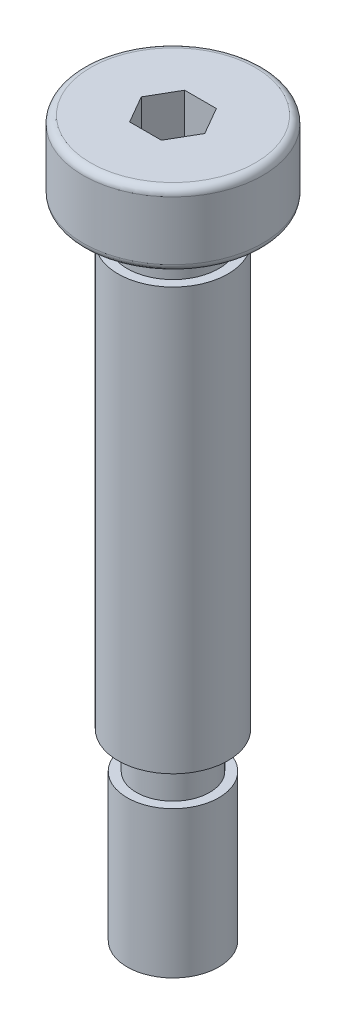
ISO-10303-21;
HEADER;
FILE_DESCRIPTION(('STEP AP214'),'2;1');
FILE_NAME('part.step','',(''),(''),'','','');
FILE_SCHEMA(('AUTOMOTIVE_DESIGN { 1 0 10303 214 1 1 1 1 }'));
ENDSEC;
DATA;
#1=APPLICATION_CONTEXT('core data for automotive mechanical design processes');
#2=APPLICATION_PROTOCOL_DEFINITION('international standard','automotive_design',2000,#1);
#3=PRODUCT_CONTEXT('',#1,'mechanical');
#4=PRODUCT('Part','Part','',(#3));
#5=PRODUCT_RELATED_PRODUCT_CATEGORY('part','',(#4));
#6=PRODUCT_DEFINITION_FORMATION('','',#4);
#7=PRODUCT_DEFINITION_CONTEXT('part definition',#1,'design');
#8=PRODUCT_DEFINITION('design','',#6,#7);
#9=PRODUCT_DEFINITION_SHAPE('','',#8);
#10=(LENGTH_UNIT() NAMED_UNIT(*) SI_UNIT(.MILLI.,.METRE.));
#11=(NAMED_UNIT(*) PLANE_ANGLE_UNIT() SI_UNIT($,.RADIAN.));
#12=(NAMED_UNIT(*) SI_UNIT($,.STERADIAN.) SOLID_ANGLE_UNIT());
#13=UNCERTAINTY_MEASURE_WITH_UNIT(LENGTH_MEASURE(1.E-05),#10,'distance_accuracy_value','');
#14=(GEOMETRIC_REPRESENTATION_CONTEXT(3) GLOBAL_UNCERTAINTY_ASSIGNED_CONTEXT((#13)) GLOBAL_UNIT_ASSIGNED_CONTEXT((#10,
#11,#12)) REPRESENTATION_CONTEXT('',''));
#15=CARTESIAN_POINT('',(0.,0.,0.));
#16=DIRECTION('',(0.,0.,1.));
#17=DIRECTION('',(1.,0.,0.));
#18=AXIS2_PLACEMENT_3D('',#15,#16,#17);
#19=CARTESIAN_POINT('',(0.,39.,0.));
#20=DIRECTION('',(0.,-1.,0.));
#21=DIRECTION('',(0.,0.,-1.));
#22=AXIS2_PLACEMENT_3D('',#19,#20,#21);
#23=PLANE('',#22);
#24=DIRECTION('',(-1.,0.,0.));
#25=VECTOR('',#24,1.);
#26=CARTESIAN_POINT('',(0.866025403784438,39.,-1.5));
#27=LINE('',#26,#25);
#28=CARTESIAN_POINT('',(0.866025403784438,39.,-1.5));
#29=VERTEX_POINT('',#28);
#30=CARTESIAN_POINT('',(-0.866025403784439,39.,-1.5));
#31=VERTEX_POINT('',#30);
#32=EDGE_CURVE('E131',#29,#31,#27,.T.);
#33=ORIENTED_EDGE('',*,*,#32,.F.);
#34=DIRECTION('',(-0.5,0.,-0.866025403784438));
#35=VECTOR('',#34,1.);
#36=CARTESIAN_POINT('',(1.73205080756888,39.,0.));
#37=LINE('',#36,#35);
#38=CARTESIAN_POINT('',(1.73205080756888,39.,0.));
#39=VERTEX_POINT('',#38);
#40=EDGE_CURVE('E57',#39,#29,#37,.T.);
#41=ORIENTED_EDGE('',*,*,#40,.F.);
#42=DIRECTION('',(0.5,0.,-0.866025403784438));
#43=VECTOR('',#42,1.);
#44=CARTESIAN_POINT('',(0.866025403784438,39.,1.5));
#45=LINE('',#44,#43);
#46=CARTESIAN_POINT('',(0.866025403784438,39.,1.5));
#47=VERTEX_POINT('',#46);
#48=EDGE_CURVE('E140',#47,#39,#45,.T.);
#49=ORIENTED_EDGE('',*,*,#48,.F.);
#50=DIRECTION('',(1.,0.,0.));
#51=VECTOR('',#50,1.);
#52=CARTESIAN_POINT('',(-0.866025403784439,39.,1.5));
#53=LINE('',#52,#51);
#54=CARTESIAN_POINT('',(-0.866025403784439,39.,1.5));
#55=VERTEX_POINT('',#54);
#56=EDGE_CURVE('E138',#55,#47,#53,.T.);
#57=ORIENTED_EDGE('',*,*,#56,.F.);
#58=DIRECTION('',(0.5,0.,0.866025403784439));
#59=VECTOR('',#58,1.);
#60=CARTESIAN_POINT('',(-1.73205080756888,39.,0.));
#61=LINE('',#60,#59);
#62=CARTESIAN_POINT('',(-1.73205080756888,39.,0.));
#63=VERTEX_POINT('',#62);
#64=EDGE_CURVE('E105',#63,#55,#61,.T.);
#65=ORIENTED_EDGE('',*,*,#64,.F.);
#66=DIRECTION('',(-0.5,0.,0.866025403784439));
#67=VECTOR('',#66,1.);
#68=CARTESIAN_POINT('',(-0.866025403784439,39.,-1.5));
#69=LINE('',#68,#67);
#70=EDGE_CURVE('E134',#31,#63,#69,.T.);
#71=ORIENTED_EDGE('',*,*,#70,.F.);
#72=EDGE_LOOP('',(#33,#41,#49,#57,#65,#71));
#73=FACE_BOUND('',#72,.T.);
#74=CARTESIAN_POINT('',(0.,39.,0.));
#75=DIRECTION('',(0.,-1.,0.));
#76=DIRECTION('',(0.,0.,-1.));
#77=AXIS2_PLACEMENT_3D('',#74,#75,#76);
#78=CIRCLE('',#77,4.5);
#79=CARTESIAN_POINT('',(0.,39.,-4.5));
#80=VERTEX_POINT('',#79);
#81=EDGE_CURVE('E11',#80,#80,#78,.T.);
#82=ORIENTED_EDGE('',*,*,#81,.F.);
#83=EDGE_LOOP('',(#82));
#84=FACE_BOUND('',#83,.T.);
#85=ADVANCED_FACE('F43',(#73,#84),#23,.F.);
#86=CARTESIAN_POINT('',(0.,38.6,0.));
#87=DIRECTION('',(0.,-1.,0.));
#88=DIRECTION('',(0.,0.,-1.));
#89=AXIS2_PLACEMENT_3D('',#86,#87,#88);
#90=TOROIDAL_SURFACE('',#89,4.5,0.399999999999999);
#91=CARTESIAN_POINT('',(0.,38.6,0.));
#92=DIRECTION('',(0.,-1.,0.));
#93=DIRECTION('',(0.,0.,-1.));
#94=AXIS2_PLACEMENT_3D('',#91,#92,#93);
#95=CIRCLE('',#94,4.9);
#96=CARTESIAN_POINT('',(0.,38.6,-4.9));
#97=VERTEX_POINT('',#96);
#98=EDGE_CURVE('E50',#97,#97,#95,.T.);
#99=ORIENTED_EDGE('',*,*,#98,.F.);
#100=EDGE_LOOP('',(#99));
#101=FACE_BOUND('',#100,.T.);
#102=ORIENTED_EDGE('',*,*,#81,.T.);
#103=EDGE_LOOP('',(#102));
#104=FACE_BOUND('',#103,.T.);
#105=ADVANCED_FACE('F183',(#101,#104),#90,.T.);
#106=CARTESIAN_POINT('',(0.,0.,0.));
#107=DIRECTION('',(0.,-1.,0.));
#108=DIRECTION('',(0.,0.,-1.));
#109=AXIS2_PLACEMENT_3D('',#106,#107,#108);
#110=CYLINDRICAL_SURFACE('',#109,4.9);
#111=CARTESIAN_POINT('',(0.,35.4,0.));
#112=DIRECTION('',(0.,-1.,0.));
#113=DIRECTION('',(0.,0.,-1.));
#114=AXIS2_PLACEMENT_3D('',#111,#112,#113);
#115=CIRCLE('',#114,4.9);
#116=CARTESIAN_POINT('',(0.,35.4,-4.9));
#117=VERTEX_POINT('',#116);
#118=EDGE_CURVE('E176',#117,#117,#115,.T.);
#119=ORIENTED_EDGE('',*,*,#118,.F.);
#120=EDGE_LOOP('',(#119));
#121=FACE_BOUND('',#120,.T.);
#122=ORIENTED_EDGE('',*,*,#98,.T.);
#123=EDGE_LOOP('',(#122));
#124=FACE_BOUND('',#123,.T.);
#125=ADVANCED_FACE('F181',(#121,#124),#110,.T.);
#126=CARTESIAN_POINT('',(0.,35.4,0.));
#127=DIRECTION('',(0.,-1.,0.));
#128=DIRECTION('',(0.,0.,-1.));
#129=AXIS2_PLACEMENT_3D('',#126,#127,#128);
#130=TOROIDAL_SURFACE('',#129,4.5,0.399999999999998);
#131=CARTESIAN_POINT('',(0.,35.,0.));
#132=DIRECTION('',(0.,-1.,0.));
#133=DIRECTION('',(0.,0.,-1.));
#134=AXIS2_PLACEMENT_3D('',#131,#132,#133);
#135=CIRCLE('',#134,4.5);
#136=CARTESIAN_POINT('',(0.,35.,-4.5));
#137=VERTEX_POINT('',#136);
#138=EDGE_CURVE('E173',#137,#137,#135,.T.);
#139=ORIENTED_EDGE('',*,*,#138,.F.);
#140=EDGE_LOOP('',(#139));
#141=FACE_BOUND('',#140,.T.);
#142=ORIENTED_EDGE('',*,*,#118,.T.);
#143=EDGE_LOOP('',(#142));
#144=FACE_BOUND('',#143,.T.);
#145=ADVANCED_FACE('F244',(#141,#144),#130,.T.);
#146=CARTESIAN_POINT('',(-4.5,35.,0.));
#147=DIRECTION('',(0.,1.,0.));
#148=DIRECTION('',(0.,0.,1.));
#149=AXIS2_PLACEMENT_3D('',#146,#147,#148);
#150=PLANE('',#149);
#151=CARTESIAN_POINT('',(0.,35.,0.));
#152=DIRECTION('',(0.,-1.,0.));
#153=DIRECTION('',(0.,0.,-1.));
#154=AXIS2_PLACEMENT_3D('',#151,#152,#153);
#155=CIRCLE('',#154,2.5);
#156=CARTESIAN_POINT('',(0.,35.,-2.5));
#157=VERTEX_POINT('',#156);
#158=EDGE_CURVE('E170',#157,#157,#155,.T.);
#159=ORIENTED_EDGE('',*,*,#158,.F.);
#160=EDGE_LOOP('',(#159));
#161=FACE_BOUND('',#160,.T.);
#162=ORIENTED_EDGE('',*,*,#138,.T.);
#163=EDGE_LOOP('',(#162));
#164=FACE_BOUND('',#163,.T.);
#165=ADVANCED_FACE('F240',(#161,#164),#150,.F.);
#166=CARTESIAN_POINT('',(0.,0.,0.));
#167=DIRECTION('',(0.,-1.,0.));
#168=DIRECTION('',(0.,0.,-1.));
#169=AXIS2_PLACEMENT_3D('',#166,#167,#168);
#170=CYLINDRICAL_SURFACE('',#169,2.5);
#171=CARTESIAN_POINT('',(0.,33.,0.));
#172=DIRECTION('',(0.,-1.,0.));
#173=DIRECTION('',(0.,0.,-1.));
#174=AXIS2_PLACEMENT_3D('',#171,#172,#173);
#175=CIRCLE('',#174,2.5);
#176=CARTESIAN_POINT('',(0.,33.,-2.5));
#177=VERTEX_POINT('',#176);
#178=EDGE_CURVE('E167',#177,#177,#175,.T.);
#179=ORIENTED_EDGE('',*,*,#178,.F.);
#180=EDGE_LOOP('',(#179));
#181=FACE_BOUND('',#180,.T.);
#182=ORIENTED_EDGE('',*,*,#158,.T.);
#183=EDGE_LOOP('',(#182));
#184=FACE_BOUND('',#183,.T.);
#185=ADVANCED_FACE('F236',(#181,#184),#170,.T.);
#186=CARTESIAN_POINT('',(-2.5,33.,0.));
#187=DIRECTION('',(0.,-1.,0.));
#188=DIRECTION('',(0.,0.,-1.));
#189=AXIS2_PLACEMENT_3D('',#186,#187,#188);
#190=PLANE('',#189);
#191=CARTESIAN_POINT('',(0.,33.,0.));
#192=DIRECTION('',(0.,-1.,0.));
#193=DIRECTION('',(0.,0.,-1.));
#194=AXIS2_PLACEMENT_3D('',#191,#192,#193);
#195=CIRCLE('',#194,3.);
#196=CARTESIAN_POINT('',(0.,33.,-3.));
#197=VERTEX_POINT('',#196);
#198=EDGE_CURVE('E164',#197,#197,#195,.T.);
#199=ORIENTED_EDGE('',*,*,#198,.F.);
#200=EDGE_LOOP('',(#199));
#201=FACE_BOUND('',#200,.T.);
#202=ORIENTED_EDGE('',*,*,#178,.T.);
#203=EDGE_LOOP('',(#202));
#204=FACE_BOUND('',#203,.T.);
#205=ADVANCED_FACE('F232',(#201,#204),#190,.F.);
#206=CARTESIAN_POINT('',(0.,0.,0.));
#207=DIRECTION('',(0.,-1.,0.));
#208=DIRECTION('',(0.,0.,-1.));
#209=AXIS2_PLACEMENT_3D('',#206,#207,#208);
#210=CYLINDRICAL_SURFACE('',#209,3.);
#211=CARTESIAN_POINT('',(0.,10.,0.));
#212=DIRECTION('',(0.,-1.,0.));
#213=DIRECTION('',(0.,0.,-1.));
#214=AXIS2_PLACEMENT_3D('',#211,#212,#213);
#215=CIRCLE('',#214,3.);
#216=CARTESIAN_POINT('',(0.,10.,-3.));
#217=VERTEX_POINT('',#216);
#218=EDGE_CURVE('E161',#217,#217,#215,.T.);
#219=ORIENTED_EDGE('',*,*,#218,.F.);
#220=EDGE_LOOP('',(#219));
#221=FACE_BOUND('',#220,.T.);
#222=ORIENTED_EDGE('',*,*,#198,.T.);
#223=EDGE_LOOP('',(#222));
#224=FACE_BOUND('',#223,.T.);
#225=ADVANCED_FACE('F228',(#221,#224),#210,.T.);
#226=CARTESIAN_POINT('',(-3.,10.,0.));
#227=DIRECTION('',(0.,1.,0.));
#228=DIRECTION('',(0.,0.,1.));
#229=AXIS2_PLACEMENT_3D('',#226,#227,#228);
#230=PLANE('',#229);
#231=CARTESIAN_POINT('',(0.,10.,0.));
#232=DIRECTION('',(0.,-1.,0.));
#233=DIRECTION('',(0.,0.,-1.));
#234=AXIS2_PLACEMENT_3D('',#231,#232,#233);
#235=CIRCLE('',#234,2.);
#236=CARTESIAN_POINT('',(0.,10.,-2.));
#237=VERTEX_POINT('',#236);
#238=EDGE_CURVE('E158',#237,#237,#235,.T.);
#239=ORIENTED_EDGE('',*,*,#238,.F.);
#240=EDGE_LOOP('',(#239));
#241=FACE_BOUND('',#240,.T.);
#242=ORIENTED_EDGE('',*,*,#218,.T.);
#243=EDGE_LOOP('',(#242));
#244=FACE_BOUND('',#243,.T.);
#245=ADVANCED_FACE('F224',(#241,#244),#230,.F.);
#246=CARTESIAN_POINT('',(0.,0.,0.));
#247=DIRECTION('',(0.,-1.,0.));
#248=DIRECTION('',(0.,0.,-1.));
#249=AXIS2_PLACEMENT_3D('',#246,#247,#248);
#250=CYLINDRICAL_SURFACE('',#249,2.);
#251=CARTESIAN_POINT('',(0.,8.,0.));
#252=DIRECTION('',(0.,-1.,0.));
#253=DIRECTION('',(0.,0.,-1.));
#254=AXIS2_PLACEMENT_3D('',#251,#252,#253);
#255=CIRCLE('',#254,2.);
#256=CARTESIAN_POINT('',(0.,8.,-2.));
#257=VERTEX_POINT('',#256);
#258=EDGE_CURVE('E155',#257,#257,#255,.T.);
#259=ORIENTED_EDGE('',*,*,#258,.F.);
#260=EDGE_LOOP('',(#259));
#261=FACE_BOUND('',#260,.T.);
#262=ORIENTED_EDGE('',*,*,#238,.T.);
#263=EDGE_LOOP('',(#262));
#264=FACE_BOUND('',#263,.T.);
#265=ADVANCED_FACE('F220',(#261,#264),#250,.T.);
#266=CARTESIAN_POINT('',(-2.,8.,0.));
#267=DIRECTION('',(0.,-1.,0.));
#268=DIRECTION('',(0.,0.,-1.));
#269=AXIS2_PLACEMENT_3D('',#266,#267,#268);
#270=PLANE('',#269);
#271=CARTESIAN_POINT('',(0.,8.,0.));
#272=DIRECTION('',(0.,-1.,0.));
#273=DIRECTION('',(0.,0.,-1.));
#274=AXIS2_PLACEMENT_3D('',#271,#272,#273);
#275=CIRCLE('',#274,2.5);
#276=CARTESIAN_POINT('',(0.,8.,-2.5));
#277=VERTEX_POINT('',#276);
#278=EDGE_CURVE('E152',#277,#277,#275,.T.);
#279=ORIENTED_EDGE('',*,*,#278,.F.);
#280=EDGE_LOOP('',(#279));
#281=FACE_BOUND('',#280,.T.);
#282=ORIENTED_EDGE('',*,*,#258,.T.);
#283=EDGE_LOOP('',(#282));
#284=FACE_BOUND('',#283,.T.);
#285=ADVANCED_FACE('F216',(#281,#284),#270,.F.);
#286=CARTESIAN_POINT('',(0.,0.,0.));
#287=DIRECTION('',(0.,-1.,0.));
#288=DIRECTION('',(0.,0.,-1.));
#289=AXIS2_PLACEMENT_3D('',#286,#287,#288);
#290=CYLINDRICAL_SURFACE('',#289,2.5);
#291=CARTESIAN_POINT('',(0.,0.,0.));
#292=DIRECTION('',(0.,-1.,0.));
#293=DIRECTION('',(0.,0.,-1.));
#294=AXIS2_PLACEMENT_3D('',#291,#292,#293);
#295=CIRCLE('',#294,2.5);
#296=CARTESIAN_POINT('',(0.,0.,-2.5));
#297=VERTEX_POINT('',#296);
#298=EDGE_CURVE('E144',#297,#297,#295,.T.);
#299=ORIENTED_EDGE('',*,*,#298,.F.);
#300=EDGE_LOOP('',(#299));
#301=FACE_BOUND('',#300,.T.);
#302=ORIENTED_EDGE('',*,*,#278,.T.);
#303=EDGE_LOOP('',(#302));
#304=FACE_BOUND('',#303,.T.);
#305=ADVANCED_FACE('F208',(#301,#304),#290,.T.);
#306=CARTESIAN_POINT('',(-2.5,0.,0.));
#307=DIRECTION('',(0.,1.,0.));
#308=DIRECTION('',(0.,0.,1.));
#309=AXIS2_PLACEMENT_3D('',#306,#307,#308);
#310=PLANE('',#309);
#311=ORIENTED_EDGE('',*,*,#298,.T.);
#312=EDGE_LOOP('',(#311));
#313=FACE_BOUND('',#312,.T.);
#314=ADVANCED_FACE('F202',(#313),#310,.F.);
#315=CARTESIAN_POINT('',(1.73205080756888,35.5,0.));
#316=DIRECTION('',(0.866025403784438,0.,-0.5));
#317=DIRECTION('',(-0.5,0.,-0.866025403784439));
#318=AXIS2_PLACEMENT_3D('',#315,#316,#317);
#319=PLANE('',#318);
#320=ORIENTED_EDGE('',*,*,#40,.T.);
#321=DIRECTION('',(0.,1.,0.));
#322=VECTOR('',#321,1.);
#323=CARTESIAN_POINT('',(0.866025403784438,35.5,-1.5));
#324=LINE('',#323,#322);
#325=CARTESIAN_POINT('',(0.866025403784438,35.5,-1.5));
#326=VERTEX_POINT('',#325);
#327=EDGE_CURVE('E87',#326,#29,#324,.T.);
#328=ORIENTED_EDGE('',*,*,#327,.F.);
#329=DIRECTION('',(-0.5,0.,-0.866025403784438));
#330=VECTOR('',#329,1.);
#331=CARTESIAN_POINT('',(1.73205080756888,35.5,0.));
#332=LINE('',#331,#330);
#333=CARTESIAN_POINT('',(1.73205080756888,35.5,0.));
#334=VERTEX_POINT('',#333);
#335=EDGE_CURVE('E142',#334,#326,#332,.T.);
#336=ORIENTED_EDGE('',*,*,#335,.F.);
#337=DIRECTION('',(0.,1.,0.));
#338=VECTOR('',#337,1.);
#339=CARTESIAN_POINT('',(1.73205080756888,35.5,0.));
#340=LINE('',#339,#338);
#341=EDGE_CURVE('E65',#334,#39,#340,.T.);
#342=ORIENTED_EDGE('',*,*,#341,.T.);
#343=EDGE_LOOP('',(#320,#328,#336,#342));
#344=FACE_BOUND('',#343,.T.);
#345=ADVANCED_FACE('F200',(#344),#319,.F.);
#346=CARTESIAN_POINT('',(0.866025403784438,35.5,1.5));
#347=DIRECTION('',(0.866025403784438,0.,0.5));
#348=DIRECTION('',(0.5,0.,-0.866025403784439));
#349=AXIS2_PLACEMENT_3D('',#346,#347,#348);
#350=PLANE('',#349);
#351=ORIENTED_EDGE('',*,*,#48,.T.);
#352=ORIENTED_EDGE('',*,*,#341,.F.);
#353=DIRECTION('',(0.5,0.,-0.866025403784438));
#354=VECTOR('',#353,1.);
#355=CARTESIAN_POINT('',(0.866025403784438,35.5,1.5));
#356=LINE('',#355,#354);
#357=CARTESIAN_POINT('',(0.866025403784438,35.5,1.5));
#358=VERTEX_POINT('',#357);
#359=EDGE_CURVE('E117',#358,#334,#356,.T.);
#360=ORIENTED_EDGE('',*,*,#359,.F.);
#361=DIRECTION('',(0.,1.,0.));
#362=VECTOR('',#361,1.);
#363=CARTESIAN_POINT('',(0.866025403784438,35.5,1.5));
#364=LINE('',#363,#362);
#365=EDGE_CURVE('E109',#358,#47,#364,.T.);
#366=ORIENTED_EDGE('',*,*,#365,.T.);
#367=EDGE_LOOP('',(#351,#352,#360,#366));
#368=FACE_BOUND('',#367,.T.);
#369=ADVANCED_FACE('F201',(#368),#350,.F.);
#370=CARTESIAN_POINT('',(-0.866025403784439,35.5,1.5));
#371=DIRECTION('',(0.,0.,1.));
#372=DIRECTION('',(1.,0.,0.));
#373=AXIS2_PLACEMENT_3D('',#370,#371,#372);
#374=PLANE('',#373);
#375=ORIENTED_EDGE('',*,*,#56,.T.);
#376=ORIENTED_EDGE('',*,*,#365,.F.);
#377=DIRECTION('',(1.,0.,0.));
#378=VECTOR('',#377,1.);
#379=CARTESIAN_POINT('',(-0.866025403784439,35.5,1.5));
#380=LINE('',#379,#378);
#381=CARTESIAN_POINT('',(-0.866025403784439,35.5,1.5));
#382=VERTEX_POINT('',#381);
#383=EDGE_CURVE('E113',#382,#358,#380,.T.);
#384=ORIENTED_EDGE('',*,*,#383,.F.);
#385=DIRECTION('',(0.,1.,0.));
#386=VECTOR('',#385,1.);
#387=CARTESIAN_POINT('',(-0.866025403784439,35.5,1.5));
#388=LINE('',#387,#386);
#389=EDGE_CURVE('E98',#382,#55,#388,.T.);
#390=ORIENTED_EDGE('',*,*,#389,.T.);
#391=EDGE_LOOP('',(#375,#376,#384,#390));
#392=FACE_BOUND('',#391,.T.);
#393=ADVANCED_FACE('F114',(#392),#374,.F.);
#394=CARTESIAN_POINT('',(-1.73205080756888,35.5,0.));
#395=DIRECTION('',(-0.866025403784439,0.,0.5));
#396=DIRECTION('',(0.5,0.,0.866025403784439));
#397=AXIS2_PLACEMENT_3D('',#394,#395,#396);
#398=PLANE('',#397);
#399=ORIENTED_EDGE('',*,*,#64,.T.);
#400=ORIENTED_EDGE('',*,*,#389,.F.);
#401=DIRECTION('',(0.5,0.,0.866025403784439));
#402=VECTOR('',#401,1.);
#403=CARTESIAN_POINT('',(-1.73205080756888,35.5,0.));
#404=LINE('',#403,#402);
#405=CARTESIAN_POINT('',(-1.73205080756888,35.5,0.));
#406=VERTEX_POINT('',#405);
#407=EDGE_CURVE('E102',#406,#382,#404,.T.);
#408=ORIENTED_EDGE('',*,*,#407,.F.);
#409=DIRECTION('',(0.,1.,0.));
#410=VECTOR('',#409,1.);
#411=CARTESIAN_POINT('',(-1.73205080756888,35.5,0.));
#412=LINE('',#411,#410);
#413=EDGE_CURVE('E110',#406,#63,#412,.T.);
#414=ORIENTED_EDGE('',*,*,#413,.T.);
#415=EDGE_LOOP('',(#399,#400,#408,#414));
#416=FACE_BOUND('',#415,.T.);
#417=ADVANCED_FACE('F100',(#416),#398,.F.);
#418=CARTESIAN_POINT('',(-0.866025403784439,35.5,-1.5));
#419=DIRECTION('',(-0.866025403784439,0.,-0.5));
#420=DIRECTION('',(-0.5,0.,0.866025403784439));
#421=AXIS2_PLACEMENT_3D('',#418,#419,#420);
#422=PLANE('',#421);
#423=ORIENTED_EDGE('',*,*,#70,.T.);
#424=ORIENTED_EDGE('',*,*,#413,.F.);
#425=DIRECTION('',(-0.5,0.,0.866025403784439));
#426=VECTOR('',#425,1.);
#427=CARTESIAN_POINT('',(-0.866025403784439,35.5,-1.5));
#428=LINE('',#427,#426);
#429=CARTESIAN_POINT('',(-0.866025403784439,35.5,-1.5));
#430=VERTEX_POINT('',#429);
#431=EDGE_CURVE('E123',#430,#406,#428,.T.);
#432=ORIENTED_EDGE('',*,*,#431,.F.);
#433=DIRECTION('',(0.,1.,0.));
#434=VECTOR('',#433,1.);
#435=CARTESIAN_POINT('',(-0.866025403784439,35.5,-1.5));
#436=LINE('',#435,#434);
#437=EDGE_CURVE('E147',#430,#31,#436,.T.);
#438=ORIENTED_EDGE('',*,*,#437,.T.);
#439=EDGE_LOOP('',(#423,#424,#432,#438));
#440=FACE_BOUND('',#439,.T.);
#441=ADVANCED_FACE('F337',(#440),#422,.F.);
#442=CARTESIAN_POINT('',(0.866025403784438,35.5,-1.5));
#443=DIRECTION('',(0.,0.,-1.));
#444=DIRECTION('',(-1.,0.,0.));
#445=AXIS2_PLACEMENT_3D('',#442,#443,#444);
#446=PLANE('',#445);
#447=ORIENTED_EDGE('',*,*,#32,.T.);
#448=ORIENTED_EDGE('',*,*,#437,.F.);
#449=DIRECTION('',(-1.,0.,0.));
#450=VECTOR('',#449,1.);
#451=CARTESIAN_POINT('',(0.866025403784438,35.5,-1.5));
#452=LINE('',#451,#450);
#453=EDGE_CURVE('E125',#326,#430,#452,.T.);
#454=ORIENTED_EDGE('',*,*,#453,.F.);
#455=ORIENTED_EDGE('',*,*,#327,.T.);
#456=EDGE_LOOP('',(#447,#448,#454,#455));
#457=FACE_BOUND('',#456,.T.);
#458=ADVANCED_FACE('F198',(#457),#446,.F.);
#459=CARTESIAN_POINT('',(0.,35.5,0.));
#460=DIRECTION('',(0.,1.,0.));
#461=DIRECTION('',(0.,0.,1.));
#462=AXIS2_PLACEMENT_3D('',#459,#460,#461);
#463=PLANE('',#462);
#464=ORIENTED_EDGE('',*,*,#335,.T.);
#465=ORIENTED_EDGE('',*,*,#453,.T.);
#466=ORIENTED_EDGE('',*,*,#431,.T.);
#467=ORIENTED_EDGE('',*,*,#407,.T.);
#468=ORIENTED_EDGE('',*,*,#383,.T.);
#469=ORIENTED_EDGE('',*,*,#359,.T.);
#470=EDGE_LOOP('',(#464,#465,#466,#467,#468,#469));
#471=FACE_BOUND('',#470,.T.);
#472=ADVANCED_FACE('F120',(#471),#463,.T.);
#473=CLOSED_SHELL('',(#85,#105,#125,#145,#165,#185,#205,#225,#245,#265,#285,#305,#314,#345,#369,
#393,#417,#441,#458,#472));
#474=MANIFOLD_SOLID_BREP('B2',#473);
#475=ADVANCED_BREP_SHAPE_REPRESENTATION('',(#18,#474),#14);
#476=SHAPE_DEFINITION_REPRESENTATION(#9,#475);
ENDSEC;
END-ISO-10303-21;
